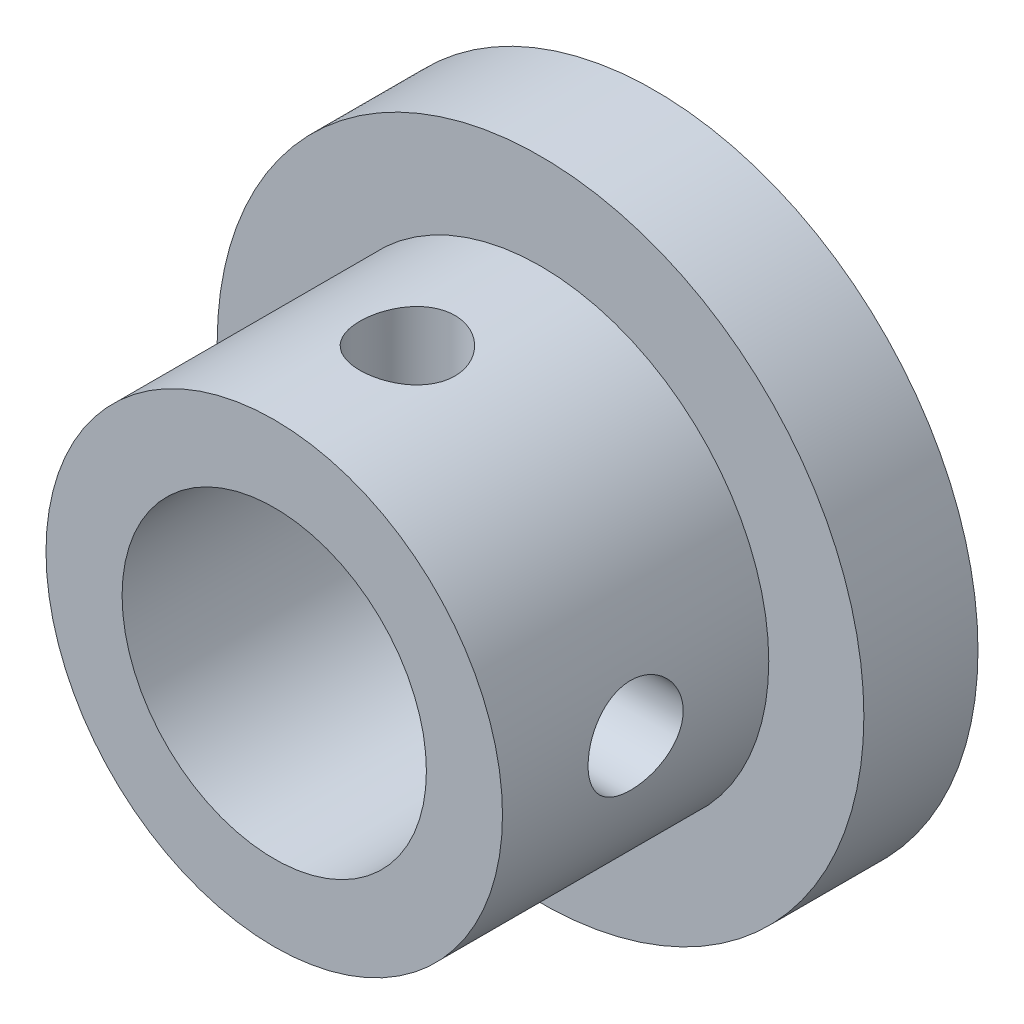
ISO-10303-21;
HEADER;
FILE_DESCRIPTION(('STEP AP214'),'2;1');
FILE_NAME('part.step','',(''),(''),'','','');
FILE_SCHEMA(('AUTOMOTIVE_DESIGN { 1 0 10303 214 1 1 1 1 }'));
ENDSEC;
DATA;
#1=APPLICATION_CONTEXT('core data for automotive mechanical design processes');
#2=APPLICATION_PROTOCOL_DEFINITION('international standard','automotive_design',2000,#1);
#3=PRODUCT_CONTEXT('',#1,'mechanical');
#4=PRODUCT('Part','Part','',(#3));
#5=PRODUCT_RELATED_PRODUCT_CATEGORY('part','',(#4));
#6=PRODUCT_DEFINITION_FORMATION('','',#4);
#7=PRODUCT_DEFINITION_CONTEXT('part definition',#1,'design');
#8=PRODUCT_DEFINITION('design','',#6,#7);
#9=PRODUCT_DEFINITION_SHAPE('','',#8);
#10=(LENGTH_UNIT() NAMED_UNIT(*) SI_UNIT(.MILLI.,.METRE.));
#11=(NAMED_UNIT(*) PLANE_ANGLE_UNIT() SI_UNIT($,.RADIAN.));
#12=(NAMED_UNIT(*) SI_UNIT($,.STERADIAN.) SOLID_ANGLE_UNIT());
#13=UNCERTAINTY_MEASURE_WITH_UNIT(LENGTH_MEASURE(1.E-05),#10,'distance_accuracy_value','');
#14=(GEOMETRIC_REPRESENTATION_CONTEXT(3) GLOBAL_UNCERTAINTY_ASSIGNED_CONTEXT((#13)) GLOBAL_UNIT_ASSIGNED_CONTEXT((#10,
#11,#12)) REPRESENTATION_CONTEXT('',''));
#15=CARTESIAN_POINT('',(0.,0.,0.));
#16=DIRECTION('',(0.,0.,1.));
#17=DIRECTION('',(1.,0.,0.));
#18=AXIS2_PLACEMENT_3D('',#15,#16,#17);
#19=CARTESIAN_POINT('',(0.,0.,3.));
#20=DIRECTION('',(0.,0.,-1.));
#21=DIRECTION('',(-1.,0.,0.));
#22=AXIS2_PLACEMENT_3D('',#19,#20,#21);
#23=CYLINDRICAL_SURFACE('',#22,8.5);
#24=CARTESIAN_POINT('',(0.,0.,3.));
#25=DIRECTION('',(0.,0.,1.));
#26=DIRECTION('',(1.,0.,0.));
#27=AXIS2_PLACEMENT_3D('',#24,#25,#26);
#28=CIRCLE('',#27,8.5);
#29=CARTESIAN_POINT('',(8.5,0.,3.));
#30=VERTEX_POINT('',#29);
#31=EDGE_CURVE('E40',#30,#30,#28,.T.);
#32=ORIENTED_EDGE('',*,*,#31,.F.);
#33=EDGE_LOOP('',(#32));
#34=FACE_BOUND('',#33,.T.);
#35=CARTESIAN_POINT('',(0.,0.,0.));
#36=DIRECTION('',(0.,0.,1.));
#37=DIRECTION('',(1.,0.,0.));
#38=AXIS2_PLACEMENT_3D('',#35,#36,#37);
#39=CIRCLE('',#38,8.5);
#40=CARTESIAN_POINT('',(8.5,0.,0.));
#41=VERTEX_POINT('',#40);
#42=EDGE_CURVE('E36',#41,#41,#39,.T.);
#43=ORIENTED_EDGE('',*,*,#42,.T.);
#44=EDGE_LOOP('',(#43));
#45=FACE_BOUND('',#44,.T.);
#46=ADVANCED_FACE('F33',(#34,#45),#23,.T.);
#47=CARTESIAN_POINT('',(0.,0.,3.));
#48=DIRECTION('',(0.,0.,1.));
#49=DIRECTION('',(1.,0.,0.));
#50=AXIS2_PLACEMENT_3D('',#47,#48,#49);
#51=PLANE('',#50);
#52=CARTESIAN_POINT('',(0.,0.,3.));
#53=DIRECTION('',(0.,0.,1.));
#54=DIRECTION('',(1.,0.,0.));
#55=AXIS2_PLACEMENT_3D('',#52,#53,#54);
#56=CIRCLE('',#55,6.);
#57=CARTESIAN_POINT('',(6.,0.,3.));
#58=VERTEX_POINT('',#57);
#59=EDGE_CURVE('E10',#58,#58,#56,.T.);
#60=ORIENTED_EDGE('',*,*,#59,.F.);
#61=EDGE_LOOP('',(#60));
#62=FACE_BOUND('',#61,.T.);
#63=ORIENTED_EDGE('',*,*,#31,.T.);
#64=EDGE_LOOP('',(#63));
#65=FACE_BOUND('',#64,.T.);
#66=ADVANCED_FACE('F97',(#62,#65),#51,.T.);
#67=CARTESIAN_POINT('',(0.,0.,0.));
#68=DIRECTION('',(0.,0.,1.));
#69=DIRECTION('',(1.,0.,0.));
#70=AXIS2_PLACEMENT_3D('',#67,#68,#69);
#71=PLANE('',#70);
#72=CARTESIAN_POINT('',(0.,0.,0.));
#73=DIRECTION('',(0.,0.,-1.));
#74=DIRECTION('',(-1.,0.,0.));
#75=AXIS2_PLACEMENT_3D('',#72,#73,#74);
#76=CIRCLE('',#75,4.);
#77=CARTESIAN_POINT('',(-4.,0.,0.));
#78=VERTEX_POINT('',#77);
#79=EDGE_CURVE('E49',#78,#78,#76,.T.);
#80=ORIENTED_EDGE('',*,*,#79,.F.);
#81=EDGE_LOOP('',(#80));
#82=FACE_BOUND('',#81,.T.);
#83=ORIENTED_EDGE('',*,*,#42,.F.);
#84=EDGE_LOOP('',(#83));
#85=FACE_BOUND('',#84,.T.);
#86=ADVANCED_FACE('F93',(#82,#85),#71,.F.);
#87=CARTESIAN_POINT('',(0.,0.,10.));
#88=DIRECTION('',(0.,0.,-1.));
#89=DIRECTION('',(-1.,0.,0.));
#90=AXIS2_PLACEMENT_3D('',#87,#88,#89);
#91=CYLINDRICAL_SURFACE('',#90,6.);
#92=CARTESIAN_POINT('',(0.,6.,7.75));
#93=CARTESIAN_POINT('',(-0.0694090417016607,5.99999871526651,7.74999752253078));
#94=CARTESIAN_POINT('',(-0.138848789520876,5.99878328775043,7.74419933428125));
#95=CARTESIAN_POINT('',(-0.275761316266993,5.9940520099068,7.72118065046715));
#96=CARTESIAN_POINT('',(-0.343232560128313,5.99053441189248,7.70395147696307));
#97=CARTESIAN_POINT('',(-0.474209132291342,5.98159109196202,7.65862954507818));
#98=CARTESIAN_POINT('',(-0.537718336709185,5.97616727052645,7.63054760400111));
#99=CARTESIAN_POINT('',(-0.659120328605958,5.96399927809859,7.56435039114382));
#100=CARTESIAN_POINT('',(-0.717013367534327,5.95725516625975,7.52623556884417));
#101=CARTESIAN_POINT('',(-0.826390324308837,5.9430770002465,7.44046365980936));
#102=CARTESIAN_POINT('',(-0.877780244162685,5.93563505848531,7.39268799876492));
#103=CARTESIAN_POINT('',(-0.971877776769393,5.92095657692448,7.28920534080489));
#104=CARTESIAN_POINT('',(-1.01458467096099,5.91372005416683,7.23349768812774));
#105=CARTESIAN_POINT('',(-1.09051031677217,5.90019442595308,7.11504803123384));
#106=CARTESIAN_POINT('',(-1.12363054680651,5.89391545174828,7.05224161549726));
#107=CARTESIAN_POINT('',(-1.17881119348064,5.8831284065002,6.92180254822725));
#108=CARTESIAN_POINT('',(-1.20087280167641,5.87862014467568,6.85417041755746));
#109=CARTESIAN_POINT('',(-1.23300240133737,5.87196500986123,6.71701476258436));
#110=CARTESIAN_POINT('',(-1.24323597696799,5.86978556855865,6.64753164066523));
#111=CARTESIAN_POINT('',(-1.25193357655615,5.86793690716491,6.50780315713737));
#112=CARTESIAN_POINT('',(-1.25039890894687,5.86826740800981,6.4375578811347));
#113=CARTESIAN_POINT('',(-1.23573719037197,5.87137174319175,6.29951897202482));
#114=CARTESIAN_POINT('',(-1.2228010523272,5.87410533679901,6.23170402033879));
#115=CARTESIAN_POINT('',(-1.18600543529945,5.88164437615942,6.09922849035507));
#116=CARTESIAN_POINT('',(-1.16214539481382,5.88644992841317,6.03456807439367));
#117=CARTESIAN_POINT('',(-1.10400003213928,5.89763191464102,5.90969277158402));
#118=CARTESIAN_POINT('',(-1.06964002534237,5.90401953785586,5.84951370347293));
#119=CARTESIAN_POINT('',(-0.991522699274817,5.91763890010721,5.73570425573184));
#120=CARTESIAN_POINT('',(-0.947764212262588,5.92487074398537,5.68207469116402));
#121=CARTESIAN_POINT('',(-0.851074921546783,5.93953730929909,5.58178603891963));
#122=CARTESIAN_POINT('',(-0.797981433412082,5.94697323199473,5.53528383110299));
#123=CARTESIAN_POINT('',(-0.684667288611798,5.96108088143001,5.45181955777103));
#124=CARTESIAN_POINT('',(-0.624446525025766,5.96775259670236,5.4148576354016));
#125=CARTESIAN_POINT('',(-0.498405541235479,5.97959870942815,5.35148991846405));
#126=CARTESIAN_POINT('',(-0.4325754619265,5.98477039710258,5.32510319543288));
#127=CARTESIAN_POINT('',(-0.297284620972156,5.99301338211281,5.28380829516451));
#128=CARTESIAN_POINT('',(-0.22782433859509,5.99608495596053,5.2688986067686));
#129=CARTESIAN_POINT('',(-0.0885918657008356,5.99974275215456,5.25120574793212));
#130=CARTESIAN_POINT('',(-0.0188480555261792,6.00037293537579,5.24820805850575));
#131=CARTESIAN_POINT('',(0.120143798757714,5.99919952252774,5.2538449499691));
#132=CARTESIAN_POINT('',(0.189391872962258,5.99739607548153,5.2624788186016));
#133=CARTESIAN_POINT('',(0.324726367119813,5.99158564979184,5.29095565346953));
#134=CARTESIAN_POINT('',(0.390837192894206,5.98760052868077,5.31068748538347));
#135=CARTESIAN_POINT('',(0.518811446661331,5.97787227242395,5.36067786042141));
#136=CARTESIAN_POINT('',(0.580674536336775,5.97212899744579,5.39093724086598));
#137=CARTESIAN_POINT('',(0.699294306943494,5.95941241490714,5.46158037823756));
#138=CARTESIAN_POINT('',(0.755973219469834,5.9524239381233,5.50209192956906));
#139=CARTESIAN_POINT('',(0.86180544588652,5.93802568299709,5.59191956307627));
#140=CARTESIAN_POINT('',(0.910957877913286,5.93061585542511,5.64123667551894));
#141=CARTESIAN_POINT('',(1.0011786486518,5.91606024531377,5.7482555769997));
#142=CARTESIAN_POINT('',(1.04209914600204,5.90892089307501,5.80608303195528));
#143=CARTESIAN_POINT('',(1.11364719079243,5.89585601015805,5.92791628421379));
#144=CARTESIAN_POINT('',(1.14427516677864,5.88993042894651,5.99192182413911));
#145=CARTESIAN_POINT('',(1.19417246443922,5.88001700708041,6.12396119629823));
#146=CARTESIAN_POINT('',(1.21350309828032,5.87601872784687,6.19197103716584));
#147=CARTESIAN_POINT('',(1.24044038523407,5.87039184709697,6.33036655049226));
#148=CARTESIAN_POINT('',(1.24804871544441,5.86876290660367,6.40075188161944));
#149=CARTESIAN_POINT('',(1.25125926487611,5.86807907308506,6.54041340099965));
#150=CARTESIAN_POINT('',(1.24709542622725,5.86897402321502,6.60968407022206));
#151=CARTESIAN_POINT('',(1.22739905314032,5.87312447254928,6.74651400892022));
#152=CARTESIAN_POINT('',(1.21186662782266,5.87637994909626,6.81407329481611));
#153=CARTESIAN_POINT('',(1.16998217768585,5.88486132447716,6.94539777189066));
#154=CARTESIAN_POINT('',(1.14366117568421,5.8900815700793,7.00917324648693));
#155=CARTESIAN_POINT('',(1.08097457299757,5.90190705738738,7.13143877602667));
#156=CARTESIAN_POINT('',(1.0446080398303,5.9085124276546,7.18992833963313));
#157=CARTESIAN_POINT('',(0.962073695342411,5.92251579551146,7.30112162707945));
#158=CARTESIAN_POINT('',(0.915737890418226,5.92992613868404,7.35369912456498));
#159=CARTESIAN_POINT('',(0.814924438115335,5.94461839583213,7.45040949322636));
#160=CARTESIAN_POINT('',(0.760444918832968,5.9519002798488,7.49454041755149));
#161=CARTESIAN_POINT('',(0.644134427507703,5.96561444547638,7.57358857318406));
#162=CARTESIAN_POINT('',(0.582225921521349,5.97203596073244,7.60839367988629));
#163=CARTESIAN_POINT('',(0.453319843998454,5.98319908494092,7.66705022843002));
#164=CARTESIAN_POINT('',(0.386326781907244,5.98794216182101,7.69091124718188));
#165=CARTESIAN_POINT('',(0.266015292900106,5.99432499781443,7.72254027828843));
#166=CARTESIAN_POINT('',(0.21336759372793,5.99644035661395,7.73281876320886));
#167=CARTESIAN_POINT('',(0.107152674176537,5.99927832789758,7.74654945427733));
#168=CARTESIAN_POINT('',(0.0535854878488721,6.00000099184586,7.75000191266719));
#169=CARTESIAN_POINT('',(0.,6.,7.75));
#170=B_SPLINE_CURVE_WITH_KNOTS('',3,(#92,#93,#94,#95,#96,#97,#98,#99,#100,#101,#102,#103,#104,
#105,#106,#107,#108,#109,#110,#111,#112,#113,#114,#115,#116,#117,#118,#119,#120,#121,#122,#123,
#124,#125,#126,#127,#128,#129,#130,#131,#132,#133,#134,#135,#136,#137,#138,#139,#140,#141,#142,
#143,#144,#145,#146,#147,#148,#149,#150,#151,#152,#153,#154,#155,#156,#157,#158,#159,#160,#161,
#162,#163,#164,#165,#166,#167,#168,#169),.UNSPECIFIED.,.T.,.F.,(4,2,2,2,2,2,2,2,2,2,2,2,2,2,2,2,
2,2,2,2,2,2,2,2,2,2,2,2,2,2,2,2,2,2,2,2,2,2,4),(0.,0.208031045103183,0.416220199906225,
0.624202378825443,0.83217524157299,1.04287526388123,1.25359271551786,1.46640449178549,
1.6791933328549,1.88896575169854,2.09871484767165,2.3050171212906,2.5113300003028,
2.71914592416749,2.92698768368034,3.13889526355466,3.35080602278218,3.56309724499662,
3.77536051045771,3.98378339407675,4.19219351552278,4.39855286632622,4.60492863390933,
4.81401583995737,5.02312752564574,5.23571263829336,5.44828889851309,5.65970050095025,
5.87108185414185,6.07829223291039,6.28550062281361,6.49211731393255,6.6987531908148,
6.90919024830309,7.11967575117369,7.33258864398256,7.54531486464973,7.7059258847728,
7.86653096973391),.UNSPECIFIED.);
#171=CARTESIAN_POINT('',(0.,6.,7.75));
#172=VERTEX_POINT('',#171);
#173=EDGE_CURVE('E159',#172,#172,#170,.T.);
#174=ORIENTED_EDGE('',*,*,#173,.T.);
#175=EDGE_LOOP('',(#174));
#176=FACE_BOUND('',#175,.T.);
#177=CARTESIAN_POINT('',(6.,0.,5.25));
#178=CARTESIAN_POINT('',(5.99999871526651,-0.0694090417016607,5.25000247746922));
#179=CARTESIAN_POINT('',(5.99878328775043,-0.138848789520876,5.25580066571875));
#180=CARTESIAN_POINT('',(5.9940520099068,-0.275761316266993,5.27881934953285));
#181=CARTESIAN_POINT('',(5.99053441189248,-0.343232560128313,5.29604852303693));
#182=CARTESIAN_POINT('',(5.98159109196202,-0.474209132291342,5.34137045492182));
#183=CARTESIAN_POINT('',(5.97616727052645,-0.537718336709185,5.36945239599889));
#184=CARTESIAN_POINT('',(5.96399927809859,-0.659120328605958,5.43564960885618));
#185=CARTESIAN_POINT('',(5.95725516625975,-0.717013367534327,5.47376443115583));
#186=CARTESIAN_POINT('',(5.9430770002465,-0.826390324308837,5.55953634019065));
#187=CARTESIAN_POINT('',(5.93563505848531,-0.877780244162685,5.60731200123508));
#188=CARTESIAN_POINT('',(5.92095657692448,-0.971877776769393,5.71079465919511));
#189=CARTESIAN_POINT('',(5.91372005416683,-1.01458467096099,5.76650231187226));
#190=CARTESIAN_POINT('',(5.90019442595308,-1.09051031677217,5.88495196876616));
#191=CARTESIAN_POINT('',(5.89391545174828,-1.12363054680651,5.94775838450274));
#192=CARTESIAN_POINT('',(5.8831284065002,-1.17881119348064,6.07819745177276));
#193=CARTESIAN_POINT('',(5.87862014467568,-1.20087280167641,6.14582958244254));
#194=CARTESIAN_POINT('',(5.87196500986123,-1.23300240133737,6.28298523741564));
#195=CARTESIAN_POINT('',(5.86978556855865,-1.24323597696799,6.35246835933477));
#196=CARTESIAN_POINT('',(5.86793690716491,-1.25193357655615,6.49219684286263));
#197=CARTESIAN_POINT('',(5.86826740800981,-1.25039890894687,6.5624421188653));
#198=CARTESIAN_POINT('',(5.87137174319175,-1.23573719037197,6.70048102797518));
#199=CARTESIAN_POINT('',(5.87410533679901,-1.2228010523272,6.76829597966121));
#200=CARTESIAN_POINT('',(5.88164437615942,-1.18600543529945,6.90077150964493));
#201=CARTESIAN_POINT('',(5.88644992841317,-1.16214539481382,6.96543192560633));
#202=CARTESIAN_POINT('',(5.89763191464102,-1.10400003213928,7.09030722841598));
#203=CARTESIAN_POINT('',(5.90401953785585,-1.06964002534237,7.15048629652707));
#204=CARTESIAN_POINT('',(5.91763890010721,-0.991522699274818,7.26429574426816));
#205=CARTESIAN_POINT('',(5.92487074398537,-0.947764212262588,7.31792530883598));
#206=CARTESIAN_POINT('',(5.93953730929909,-0.851074921546783,7.41821396108037));
#207=CARTESIAN_POINT('',(5.94697323199473,-0.797981433412082,7.46471616889701));
#208=CARTESIAN_POINT('',(5.96108088143001,-0.684667288611798,7.54818044222897));
#209=CARTESIAN_POINT('',(5.96775259670236,-0.624446525025766,7.5851423645984));
#210=CARTESIAN_POINT('',(5.97959870942815,-0.498405541235479,7.64851008153595));
#211=CARTESIAN_POINT('',(5.98477039710258,-0.4325754619265,7.67489680456712));
#212=CARTESIAN_POINT('',(5.99301338211281,-0.297284620972156,7.71619170483549));
#213=CARTESIAN_POINT('',(5.99608495596053,-0.22782433859509,7.7311013932314));
#214=CARTESIAN_POINT('',(5.99974275215456,-0.0885918657008356,7.74879425206789));
#215=CARTESIAN_POINT('',(6.00037293537579,-0.0188480555261793,7.75179194149425));
#216=CARTESIAN_POINT('',(5.99919952252774,0.120143798757714,7.7461550500309));
#217=CARTESIAN_POINT('',(5.99739607548153,0.189391872962257,7.7375211813984));
#218=CARTESIAN_POINT('',(5.99158564979184,0.324726367119813,7.70904434653047));
#219=CARTESIAN_POINT('',(5.98760052868077,0.390837192894206,7.68931251461653));
#220=CARTESIAN_POINT('',(5.97787227242395,0.518811446661331,7.63932213957859));
#221=CARTESIAN_POINT('',(5.97212899744579,0.580674536336775,7.60906275913402));
#222=CARTESIAN_POINT('',(5.95941241490714,0.699294306943494,7.53841962176244));
#223=CARTESIAN_POINT('',(5.9524239381233,0.755973219469834,7.49790807043094));
#224=CARTESIAN_POINT('',(5.93802568299709,0.86180544588652,7.40808043692373));
#225=CARTESIAN_POINT('',(5.93061585542511,0.910957877913286,7.35876332448106));
#226=CARTESIAN_POINT('',(5.91606024531377,1.0011786486518,7.2517444230003));
#227=CARTESIAN_POINT('',(5.90892089307501,1.04209914600204,7.19391696804472));
#228=CARTESIAN_POINT('',(5.89585601015805,1.11364719079243,7.07208371578622));
#229=CARTESIAN_POINT('',(5.88993042894651,1.14427516677864,7.00807817586089));
#230=CARTESIAN_POINT('',(5.88001700708041,1.19417246443922,6.87603880370177));
#231=CARTESIAN_POINT('',(5.87601872784687,1.21350309828032,6.80802896283417));
#232=CARTESIAN_POINT('',(5.87039184709697,1.24044038523407,6.66963344950774));
#233=CARTESIAN_POINT('',(5.86876290660367,1.24804871544441,6.59924811838056));
#234=CARTESIAN_POINT('',(5.86807907308506,1.25125926487611,6.45958659900035));
#235=CARTESIAN_POINT('',(5.86897402321502,1.24709542622725,6.39031592977795));
#236=CARTESIAN_POINT('',(5.87312447254928,1.22739905314032,6.25348599107978));
#237=CARTESIAN_POINT('',(5.87637994909626,1.21186662782266,6.18592670518389));
#238=CARTESIAN_POINT('',(5.88486132447716,1.16998217768585,6.05460222810934));
#239=CARTESIAN_POINT('',(5.8900815700793,1.14366117568421,5.99082675351308));
#240=CARTESIAN_POINT('',(5.90190705738738,1.08097457299757,5.86856122397334));
#241=CARTESIAN_POINT('',(5.9085124276546,1.0446080398303,5.81007166036688));
#242=CARTESIAN_POINT('',(5.92251579551146,0.962073695342411,5.69887837292056));
#243=CARTESIAN_POINT('',(5.92992613868404,0.915737890418226,5.64630087543502));
#244=CARTESIAN_POINT('',(5.94461839583213,0.814924438115335,5.54959050677364));
#245=CARTESIAN_POINT('',(5.9519002798488,0.760444918832968,5.50545958244852));
#246=CARTESIAN_POINT('',(5.96561444547638,0.644134427507703,5.42641142681594));
#247=CARTESIAN_POINT('',(5.97203596073244,0.582225921521349,5.39160632011371));
#248=CARTESIAN_POINT('',(5.98319908494092,0.453319843998454,5.33294977156998));
#249=CARTESIAN_POINT('',(5.98794216182101,0.386326781907244,5.30908875281813));
#250=CARTESIAN_POINT('',(5.99432499781443,0.266015292900106,5.27745972171158));
#251=CARTESIAN_POINT('',(5.99644035661395,0.21336759372793,5.26718123679114));
#252=CARTESIAN_POINT('',(5.99927832789758,0.107152674176537,5.25345054572267));
#253=CARTESIAN_POINT('',(6.00000099184586,0.0535854878488721,5.24999808733281));
#254=CARTESIAN_POINT('',(6.,0.,5.25));
#255=B_SPLINE_CURVE_WITH_KNOTS('',3,(#177,#178,#179,#180,#181,#182,#183,#184,#185,#186,#187,
#188,#189,#190,#191,#192,#193,#194,#195,#196,#197,#198,#199,#200,#201,#202,#203,#204,#205,#206,
#207,#208,#209,#210,#211,#212,#213,#214,#215,#216,#217,#218,#219,#220,#221,#222,#223,#224,#225,
#226,#227,#228,#229,#230,#231,#232,#233,#234,#235,#236,#237,#238,#239,#240,#241,#242,#243,#244,
#245,#246,#247,#248,#249,#250,#251,#252,#253,#254),.UNSPECIFIED.,.T.,.F.,(4,2,2,2,2,2,2,2,2,2,2,
2,2,2,2,2,2,2,2,2,2,2,2,2,2,2,2,2,2,2,2,2,2,2,2,2,2,2,4),(0.,0.208031045103183,
0.416220199906225,0.624202378825443,0.83217524157299,1.04287526388123,1.25359271551786,
1.46640449178549,1.6791933328549,1.88896575169854,2.09871484767165,2.3050171212906,
2.5113300003028,2.71914592416749,2.92698768368034,3.13889526355466,3.35080602278218,
3.56309724499662,3.77536051045771,3.98378339407675,4.19219351552278,4.39855286632622,
4.60492863390933,4.81401583995737,5.02312752564574,5.23571263829336,5.44828889851309,
5.65970050095025,5.87108185414185,6.07829223291039,6.28550062281361,6.49211731393255,
6.6987531908148,6.90919024830309,7.11967575117369,7.33258864398256,7.54531486464973,
7.7059258847728,7.86653096973391),.UNSPECIFIED.);
#256=CARTESIAN_POINT('',(6.,0.,5.25));
#257=VERTEX_POINT('',#256);
#258=EDGE_CURVE('E53',#257,#257,#255,.T.);
#259=ORIENTED_EDGE('',*,*,#258,.T.);
#260=EDGE_LOOP('',(#259));
#261=FACE_BOUND('',#260,.T.);
#262=CARTESIAN_POINT('',(0.,0.,10.));
#263=DIRECTION('',(0.,0.,1.));
#264=DIRECTION('',(1.,0.,0.));
#265=AXIS2_PLACEMENT_3D('',#262,#263,#264);
#266=CIRCLE('',#265,6.);
#267=CARTESIAN_POINT('',(6.,0.,10.));
#268=VERTEX_POINT('',#267);
#269=EDGE_CURVE('E46',#268,#268,#266,.T.);
#270=ORIENTED_EDGE('',*,*,#269,.F.);
#271=EDGE_LOOP('',(#270));
#272=FACE_BOUND('',#271,.T.);
#273=ORIENTED_EDGE('',*,*,#59,.T.);
#274=EDGE_LOOP('',(#273));
#275=FACE_BOUND('',#274,.T.);
#276=ADVANCED_FACE('F69',(#176,#261,#272,#275),#91,.T.);
#277=CARTESIAN_POINT('',(0.,0.,10.));
#278=DIRECTION('',(0.,0.,1.));
#279=DIRECTION('',(1.,0.,0.));
#280=AXIS2_PLACEMENT_3D('',#277,#278,#279);
#281=PLANE('',#280);
#282=CARTESIAN_POINT('',(0.,0.,10.));
#283=DIRECTION('',(0.,0.,1.));
#284=DIRECTION('',(1.,0.,0.));
#285=AXIS2_PLACEMENT_3D('',#282,#283,#284);
#286=CIRCLE('',#285,4.);
#287=CARTESIAN_POINT('',(4.,0.,10.));
#288=VERTEX_POINT('',#287);
#289=EDGE_CURVE('E50',#288,#288,#286,.F.);
#290=ORIENTED_EDGE('',*,*,#289,.T.);
#291=EDGE_LOOP('',(#290));
#292=FACE_BOUND('',#291,.T.);
#293=ORIENTED_EDGE('',*,*,#269,.T.);
#294=EDGE_LOOP('',(#293));
#295=FACE_BOUND('',#294,.T.);
#296=ADVANCED_FACE('F86',(#292,#295),#281,.T.);
#297=CARTESIAN_POINT('',(0.,0.,10.001));
#298=DIRECTION('',(0.,0.,-1.));
#299=DIRECTION('',(-1.,0.,0.));
#300=AXIS2_PLACEMENT_3D('',#297,#298,#299);
#301=CYLINDRICAL_SURFACE('',#300,4.);
#302=CARTESIAN_POINT('',(0.,4.,7.75));
#303=CARTESIAN_POINT('',(0.0684391851745465,3.99999965877989,7.74999955341242));
#304=CARTESIAN_POINT('',(0.136883052502859,3.99822694984841,7.74436077305555));
#305=CARTESIAN_POINT('',(0.271769209588448,3.99132894088807,7.72201375846076));
#306=CARTESIAN_POINT('',(0.338211042725907,3.9862028819986,7.70530301863564));
#307=CARTESIAN_POINT('',(0.467128543650806,3.97315815697909,7.66143062880426));
#308=CARTESIAN_POINT('',(0.529610176985803,3.96524381499025,7.63428515534703));
#309=CARTESIAN_POINT('',(0.649134802346459,3.94743969161093,7.57038268232167));
#310=CARTESIAN_POINT('',(0.706176935444884,3.93754959899905,7.53362416821941));
#311=CARTESIAN_POINT('',(0.81496533495228,3.91650213740282,7.45034400798264));
#312=CARTESIAN_POINT('',(0.866520028156659,3.90531715926989,7.40357911493893));
#313=CARTESIAN_POINT('',(0.961197382036993,3.88310046374209,7.30213160758645));
#314=CARTESIAN_POINT('',(1.0043184728987,3.87206877523457,7.24744752250545));
#315=CARTESIAN_POINT('',(1.08194336483113,3.85111144698172,7.13005543619192));
#316=CARTESIAN_POINT('',(1.11620784150129,3.84121988301796,7.06718252247278));
#317=CARTESIAN_POINT('',(1.17359741076672,3.82407801799234,6.93620768501813));
#318=CARTESIAN_POINT('',(1.19672543771945,3.81682702128688,6.86810714420607));
#319=CARTESIAN_POINT('',(1.23048459930033,3.80607606984501,6.73077192254794));
#320=CARTESIAN_POINT('',(1.24147110007865,3.80246972929508,6.66163315636115));
#321=CARTESIAN_POINT('',(1.25174555036988,3.7991005514095,6.52240688108811));
#322=CARTESIAN_POINT('',(1.25103660995772,3.79933669227334,6.45231962917834));
#323=CARTESIAN_POINT('',(1.23821824732739,3.80353189075438,6.31612553973102));
#324=CARTESIAN_POINT('',(1.22656057869383,3.80734341745949,6.24997087413844));
#325=CARTESIAN_POINT('',(1.19290813355626,3.81802025652489,6.12060784346265));
#326=CARTESIAN_POINT('',(1.17091225844551,3.82488589343115,6.0573997922912));
#327=CARTESIAN_POINT('',(1.11688874681277,3.84101044014297,5.93464805556737));
#328=CARTESIAN_POINT('',(1.08471925662082,3.85030284660824,5.87517138930802));
#329=CARTESIAN_POINT('',(1.01136020737848,3.8702185658007,5.76231223212088));
#330=CARTESIAN_POINT('',(0.970168305215772,3.88084222394551,5.70893132974629));
#331=CARTESIAN_POINT('',(0.877716954182123,3.90281527800493,5.60722505658301));
#332=CARTESIAN_POINT('',(0.826084570592817,3.91417569605696,5.55924044222032));
#333=CARTESIAN_POINT('',(0.715364408095531,3.9359157075958,5.47252810642032));
#334=CARTESIAN_POINT('',(0.65627607734902,3.94629522838372,5.43380107078079));
#335=CARTESIAN_POINT('',(0.531664610465455,3.96501294890191,5.36647231139873));
#336=CARTESIAN_POINT('',(0.46609490691928,3.97333460648208,5.33795186453603));
#337=CARTESIAN_POINT('',(0.330767977782644,3.98687955828554,5.29244699914843));
#338=CARTESIAN_POINT('',(0.261012030724609,3.99210379325151,5.2754590777616));
#339=CARTESIAN_POINT('',(0.122185157290345,3.99871389395014,5.25408195742102));
#340=CARTESIAN_POINT('',(0.0531918487888425,4.00024022895439,5.24923145640648));
#341=CARTESIAN_POINT('',(-0.0846303057325843,3.99969799730981,5.25096622663733));
#342=CARTESIAN_POINT('',(-0.153459174306505,3.99762995581125,5.25754982732261));
#343=CARTESIAN_POINT('',(-0.287219332975851,3.99022363769772,5.2815955926064));
#344=CARTESIAN_POINT('',(-0.352204978420948,3.98496793110725,5.29878326761252));
#345=CARTESIAN_POINT('',(-0.478351928861365,3.97180121379252,5.34321435236669));
#346=CARTESIAN_POINT('',(-0.539512760449016,3.96388987514204,5.37045900402491));
#347=CARTESIAN_POINT('',(-0.657932406672231,3.94598542759568,5.43497321654879));
#348=CARTESIAN_POINT('',(-0.715059739787955,3.9359462681821,5.47247098749722));
#349=CARTESIAN_POINT('',(-0.822365850960095,3.91493410002887,5.55615321011702));
#350=CARTESIAN_POINT('',(-0.872542738043336,3.90396083845862,5.60234001774312));
#351=CARTESIAN_POINT('',(-0.966587462919656,3.88176994885247,5.70425889005369));
#352=CARTESIAN_POINT('',(-1.01012652339774,3.87055986714446,5.76029666374526));
#353=CARTESIAN_POINT('',(-1.08721250244909,3.84961947087602,5.87912661637074));
#354=CARTESIAN_POINT('',(-1.12075957972524,3.839889132814,5.94191868800443));
#355=CARTESIAN_POINT('',(-1.17670083481141,3.82311782360754,6.07234517288586));
#356=CARTESIAN_POINT('',(-1.19913819558886,3.81606646468027,6.1399596495047));
#357=CARTESIAN_POINT('',(-1.23222894320964,3.80551170941212,6.2782724933238));
#358=CARTESIAN_POINT('',(-1.2428868141461,3.80200696302675,6.34896967637131));
#359=CARTESIAN_POINT('',(-1.2517940615754,3.79908292712494,6.48800408755424));
#360=CARTESIAN_POINT('',(-1.25058279621957,3.79948604683077,6.55630345381293));
#361=CARTESIAN_POINT('',(-1.23708818129474,3.80390090472383,6.69167458491918));
#362=CARTESIAN_POINT('',(-1.22480534822559,3.80791247457319,6.758746406884));
#363=CARTESIAN_POINT('',(-1.18987729913378,3.81896814158112,6.88879403960178));
#364=CARTESIAN_POINT('',(-1.16738642405944,3.82596698183474,6.95181544109601));
#365=CARTESIAN_POINT('',(-1.11280227335064,3.84219704261348,7.07324041353135));
#366=CARTESIAN_POINT('',(-1.08070704444254,3.85142871716522,7.13164304207768));
#367=CARTESIAN_POINT('',(-1.00635675013475,3.8715348703158,7.24464597044056));
#368=CARTESIAN_POINT('',(-0.963753335241274,3.88245948922441,7.29900812950044));
#369=CARTESIAN_POINT('',(-0.870208996404849,3.90448998821726,7.3999863281118));
#370=CARTESIAN_POINT('',(-0.819265842344403,3.91559591606795,7.446600288991));
#371=CARTESIAN_POINT('',(-0.708486662823333,3.93717271952329,7.53228253836299));
#372=CARTESIAN_POINT('',(-0.648414574487381,3.94761101730634,7.57105473644997));
#373=CARTESIAN_POINT('',(-0.522279138013655,3.96626769296916,7.63789891513944));
#374=CARTESIAN_POINT('',(-0.45621815779545,3.97448694315832,7.66597510214183));
#375=CARTESIAN_POINT('',(-0.325747635373978,3.98720650733461,7.70859136760847));
#376=CARTESIAN_POINT('',(-0.261670337112546,3.99196240806139,7.72407486730534));
#377=CARTESIAN_POINT('',(-0.131729895440248,3.99835900340486,7.74477835996771));
#378=CARTESIAN_POINT('',(-0.0658671161396749,4.00000032839644,7.750000429804));
#379=CARTESIAN_POINT('',(0.,4.,7.75));
#380=B_SPLINE_CURVE_WITH_KNOTS('',3,(#302,#303,#304,#305,#306,#307,#308,#309,#310,#311,#312,
#313,#314,#315,#316,#317,#318,#319,#320,#321,#322,#323,#324,#325,#326,#327,#328,#329,#330,#331,
#332,#333,#334,#335,#336,#337,#338,#339,#340,#341,#342,#343,#344,#345,#346,#347,#348,#349,#350,
#351,#352,#353,#354,#355,#356,#357,#358,#359,#360,#361,#362,#363,#364,#365,#366,#367,#368,#369,
#370,#371,#372,#373,#374,#375,#376,#377,#378,#379),.UNSPECIFIED.,.T.,.F.,(4,2,2,2,2,2,2,2,2,2,2,
2,2,2,2,2,2,2,2,2,2,2,2,2,2,2,2,2,2,2,2,2,2,2,2,2,2,2,4),(0.,0.20507544943251,0.410197323349066,
0.615002479202435,0.81983992155839,1.03037822195158,1.24095567431276,1.45673771247494,
1.67246286279527,1.8816915016721,2.09086450295138,2.29176917422169,2.49269519979063,
2.69655642720545,2.90047066010358,3.113667472796,3.32688007413303,3.5417546068977,
3.75656384494554,3.96307568548237,4.16955735649363,4.37090626722872,4.57228005034499,
4.77856324738343,4.98490245709259,5.1994177871314,5.41392970983712,5.62760115751031,
5.84119123892431,6.04512203476054,6.24904331751084,6.44997913396671,6.65095584330174,
6.85979514006362,7.06869037373341,7.28440668126412,7.50003806666337,7.69744636651541,
7.89481470763048),.UNSPECIFIED.);
#381=CARTESIAN_POINT('',(0.,4.,7.75));
#382=VERTEX_POINT('',#381);
#383=EDGE_CURVE('E155',#382,#382,#380,.T.);
#384=ORIENTED_EDGE('',*,*,#383,.T.);
#385=EDGE_LOOP('',(#384));
#386=FACE_BOUND('',#385,.T.);
#387=CARTESIAN_POINT('',(4.,0.,5.25));
#388=CARTESIAN_POINT('',(3.99999965877989,0.0684391851745465,5.25000044658758));
#389=CARTESIAN_POINT('',(3.99822694984841,0.136883052502859,5.25563922694445));
#390=CARTESIAN_POINT('',(3.99132894088807,0.271769209588448,5.27798624153924));
#391=CARTESIAN_POINT('',(3.9862028819986,0.338211042725907,5.29469698136436));
#392=CARTESIAN_POINT('',(3.97315815697909,0.467128543650806,5.33856937119574));
#393=CARTESIAN_POINT('',(3.96524381499025,0.529610176985803,5.36571484465297));
#394=CARTESIAN_POINT('',(3.94743969161093,0.649134802346459,5.42961731767833));
#395=CARTESIAN_POINT('',(3.93754959899905,0.706176935444884,5.46637583178059));
#396=CARTESIAN_POINT('',(3.91650213740282,0.81496533495228,5.54965599201736));
#397=CARTESIAN_POINT('',(3.90531715926989,0.866520028156659,5.59642088506107));
#398=CARTESIAN_POINT('',(3.88310046374209,0.961197382036993,5.69786839241355));
#399=CARTESIAN_POINT('',(3.87206877523457,1.0043184728987,5.75255247749455));
#400=CARTESIAN_POINT('',(3.85111144698172,1.08194336483113,5.86994456380808));
#401=CARTESIAN_POINT('',(3.84121988301796,1.11620784150129,5.93281747752722));
#402=CARTESIAN_POINT('',(3.82407801799234,1.17359741076672,6.06379231498187));
#403=CARTESIAN_POINT('',(3.81682702128688,1.19672543771945,6.13189285579393));
#404=CARTESIAN_POINT('',(3.80607606984501,1.23048459930033,6.26922807745206));
#405=CARTESIAN_POINT('',(3.80246972929508,1.24147110007865,6.33836684363885));
#406=CARTESIAN_POINT('',(3.7991005514095,1.25174555036988,6.47759311891189));
#407=CARTESIAN_POINT('',(3.79933669227334,1.25103660995772,6.54768037082166));
#408=CARTESIAN_POINT('',(3.80353189075438,1.23821824732739,6.68387446026898));
#409=CARTESIAN_POINT('',(3.80734341745949,1.22656057869383,6.75002912586156));
#410=CARTESIAN_POINT('',(3.81802025652489,1.19290813355626,6.87939215653735));
#411=CARTESIAN_POINT('',(3.82488589343115,1.17091225844551,6.9426002077088));
#412=CARTESIAN_POINT('',(3.84101044014297,1.11688874681277,7.06535194443264));
#413=CARTESIAN_POINT('',(3.85030284660824,1.08471925662082,7.12482861069198));
#414=CARTESIAN_POINT('',(3.8702185658007,1.01136020737848,7.23768776787912));
#415=CARTESIAN_POINT('',(3.88084222394551,0.970168305215772,7.29106867025371));
#416=CARTESIAN_POINT('',(3.90281527800493,0.877716954182124,7.39277494341699));
#417=CARTESIAN_POINT('',(3.91417569605696,0.826084570592817,7.44075955777968));
#418=CARTESIAN_POINT('',(3.9359157075958,0.715364408095531,7.52747189357968));
#419=CARTESIAN_POINT('',(3.94629522838372,0.656276077349021,7.56619892921921));
#420=CARTESIAN_POINT('',(3.96501294890191,0.531664610465455,7.63352768860128));
#421=CARTESIAN_POINT('',(3.97333460648208,0.46609490691928,7.66204813546397));
#422=CARTESIAN_POINT('',(3.98687955828554,0.330767977782644,7.70755300085157));
#423=CARTESIAN_POINT('',(3.99210379325151,0.261012030724609,7.7245409222384));
#424=CARTESIAN_POINT('',(3.99871389395014,0.122185157290345,7.74591804257898));
#425=CARTESIAN_POINT('',(4.00024022895439,0.0531918487888425,7.75076854359352));
#426=CARTESIAN_POINT('',(3.99969799730981,-0.0846303057325843,7.74903377336267));
#427=CARTESIAN_POINT('',(3.99762995581125,-0.153459174306505,7.7424501726774));
#428=CARTESIAN_POINT('',(3.99022363769772,-0.287219332975851,7.71840440739361));
#429=CARTESIAN_POINT('',(3.98496793110725,-0.352204978420948,7.70121673238749));
#430=CARTESIAN_POINT('',(3.97180121379252,-0.478351928861365,7.65678564763331));
#431=CARTESIAN_POINT('',(3.96388987514204,-0.539512760449016,7.62954099597509));
#432=CARTESIAN_POINT('',(3.94598542759568,-0.657932406672231,7.56502678345121));
#433=CARTESIAN_POINT('',(3.9359462681821,-0.715059739787955,7.52752901250278));
#434=CARTESIAN_POINT('',(3.91493410002887,-0.822365850960095,7.44384678988298));
#435=CARTESIAN_POINT('',(3.90396083845862,-0.872542738043336,7.39765998225689));
#436=CARTESIAN_POINT('',(3.88176994885247,-0.966587462919656,7.29574110994631));
#437=CARTESIAN_POINT('',(3.87055986714446,-1.01012652339774,7.23970333625474));
#438=CARTESIAN_POINT('',(3.84961947087602,-1.08721250244909,7.12087338362926));
#439=CARTESIAN_POINT('',(3.839889132814,-1.12075957972524,7.05808131199557));
#440=CARTESIAN_POINT('',(3.82311782360754,-1.17670083481141,6.92765482711414));
#441=CARTESIAN_POINT('',(3.81606646468027,-1.19913819558886,6.8600403504953));
#442=CARTESIAN_POINT('',(3.80551170941212,-1.23222894320964,6.72172750667621));
#443=CARTESIAN_POINT('',(3.80200696302675,-1.2428868141461,6.65103032362869));
#444=CARTESIAN_POINT('',(3.79908292712494,-1.2517940615754,6.51199591244576));
#445=CARTESIAN_POINT('',(3.79948604683077,-1.25058279621957,6.44369654618707));
#446=CARTESIAN_POINT('',(3.80390090472383,-1.23708818129474,6.30832541508082));
#447=CARTESIAN_POINT('',(3.80791247457319,-1.22480534822559,6.241253593116));
#448=CARTESIAN_POINT('',(3.81896814158112,-1.18987729913378,6.11120596039822));
#449=CARTESIAN_POINT('',(3.82596698183474,-1.16738642405944,6.04818455890399));
#450=CARTESIAN_POINT('',(3.84219704261348,-1.11280227335064,5.92675958646865));
#451=CARTESIAN_POINT('',(3.85142871716522,-1.08070704444254,5.86835695792232));
#452=CARTESIAN_POINT('',(3.8715348703158,-1.00635675013475,5.75535402955944));
#453=CARTESIAN_POINT('',(3.88245948922441,-0.963753335241274,5.70099187049956));
#454=CARTESIAN_POINT('',(3.90448998821726,-0.870208996404849,5.60001367188821));
#455=CARTESIAN_POINT('',(3.91559591606795,-0.819265842344403,5.553399711009));
#456=CARTESIAN_POINT('',(3.93717271952329,-0.708486662823333,5.46771746163701));
#457=CARTESIAN_POINT('',(3.94761101730634,-0.648414574487381,5.42894526355003));
#458=CARTESIAN_POINT('',(3.96626769296916,-0.522279138013654,5.36210108486056));
#459=CARTESIAN_POINT('',(3.97448694315832,-0.45621815779545,5.33402489785817));
#460=CARTESIAN_POINT('',(3.98720650733461,-0.325747635373978,5.29140863239153));
#461=CARTESIAN_POINT('',(3.99196240806139,-0.261670337112546,5.27592513269466));
#462=CARTESIAN_POINT('',(3.99835900340486,-0.131729895440248,5.25522164003229));
#463=CARTESIAN_POINT('',(4.00000032839644,-0.0658671161396749,5.249999570196));
#464=CARTESIAN_POINT('',(4.,0.,5.25));
#465=B_SPLINE_CURVE_WITH_KNOTS('',3,(#387,#388,#389,#390,#391,#392,#393,#394,#395,#396,#397,
#398,#399,#400,#401,#402,#403,#404,#405,#406,#407,#408,#409,#410,#411,#412,#413,#414,#415,#416,
#417,#418,#419,#420,#421,#422,#423,#424,#425,#426,#427,#428,#429,#430,#431,#432,#433,#434,#435,
#436,#437,#438,#439,#440,#441,#442,#443,#444,#445,#446,#447,#448,#449,#450,#451,#452,#453,#454,
#455,#456,#457,#458,#459,#460,#461,#462,#463,#464),.UNSPECIFIED.,.T.,.F.,(4,2,2,2,2,2,2,2,2,2,2,
2,2,2,2,2,2,2,2,2,2,2,2,2,2,2,2,2,2,2,2,2,2,2,2,2,2,2,4),(0.,0.20507544943251,0.410197323349066,
0.615002479202436,0.819839921558391,1.03037822195158,1.24095567431276,1.45673771247494,
1.67246286279527,1.8816915016721,2.09086450295138,2.29176917422169,2.49269519979063,
2.69655642720545,2.90047066010358,3.113667472796,3.32688007413303,3.5417546068977,
3.75656384494554,3.96307568548237,4.16955735649363,4.37090626722872,4.572280050345,
4.77856324738343,4.98490245709259,5.1994177871314,5.41392970983712,5.62760115751031,
5.84119123892431,6.04512203476054,6.24904331751085,6.44997913396671,6.65095584330174,
6.85979514006362,7.06869037373341,7.28440668126412,7.50003806666337,7.69744636651541,
7.89481470763048),.UNSPECIFIED.);
#466=CARTESIAN_POINT('',(4.,0.,5.25));
#467=VERTEX_POINT('',#466);
#468=EDGE_CURVE('E63',#467,#467,#465,.T.);
#469=ORIENTED_EDGE('',*,*,#468,.T.);
#470=EDGE_LOOP('',(#469));
#471=FACE_BOUND('',#470,.T.);
#472=ORIENTED_EDGE('',*,*,#289,.F.);
#473=EDGE_LOOP('',(#472));
#474=FACE_BOUND('',#473,.T.);
#475=ORIENTED_EDGE('',*,*,#79,.T.);
#476=EDGE_LOOP('',(#475));
#477=FACE_BOUND('',#476,.T.);
#478=ADVANCED_FACE('F78',(#386,#471,#474,#477),#301,.F.);
#479=CARTESIAN_POINT('',(6.,0.,6.5));
#480=DIRECTION('',(1.,0.,0.));
#481=DIRECTION('',(0.,0.,-1.));
#482=AXIS2_PLACEMENT_3D('',#479,#480,#481);
#483=CYLINDRICAL_SURFACE('',#482,1.25);
#484=ORIENTED_EDGE('',*,*,#468,.F.);
#485=EDGE_LOOP('',(#484));
#486=FACE_BOUND('',#485,.T.);
#487=ORIENTED_EDGE('',*,*,#258,.F.);
#488=EDGE_LOOP('',(#487));
#489=FACE_BOUND('',#488,.T.);
#490=ADVANCED_FACE('F73',(#486,#489),#483,.F.);
#491=CARTESIAN_POINT('',(0.,6.,6.5));
#492=DIRECTION('',(0.,1.,0.));
#493=DIRECTION('',(0.,0.,1.));
#494=AXIS2_PLACEMENT_3D('',#491,#492,#493);
#495=CYLINDRICAL_SURFACE('',#494,1.25);
#496=ORIENTED_EDGE('',*,*,#383,.F.);
#497=EDGE_LOOP('',(#496));
#498=FACE_BOUND('',#497,.T.);
#499=ORIENTED_EDGE('',*,*,#173,.F.);
#500=EDGE_LOOP('',(#499));
#501=FACE_BOUND('',#500,.T.);
#502=ADVANCED_FACE('F77',(#498,#501),#495,.F.);
#503=CLOSED_SHELL('',(#46,#66,#86,#276,#296,#478,#490,#502));
#504=MANIFOLD_SOLID_BREP('B2',#503);
#505=ADVANCED_BREP_SHAPE_REPRESENTATION('',(#18,#504),#14);
#506=SHAPE_DEFINITION_REPRESENTATION(#9,#505);
ENDSEC;
END-ISO-10303-21;
